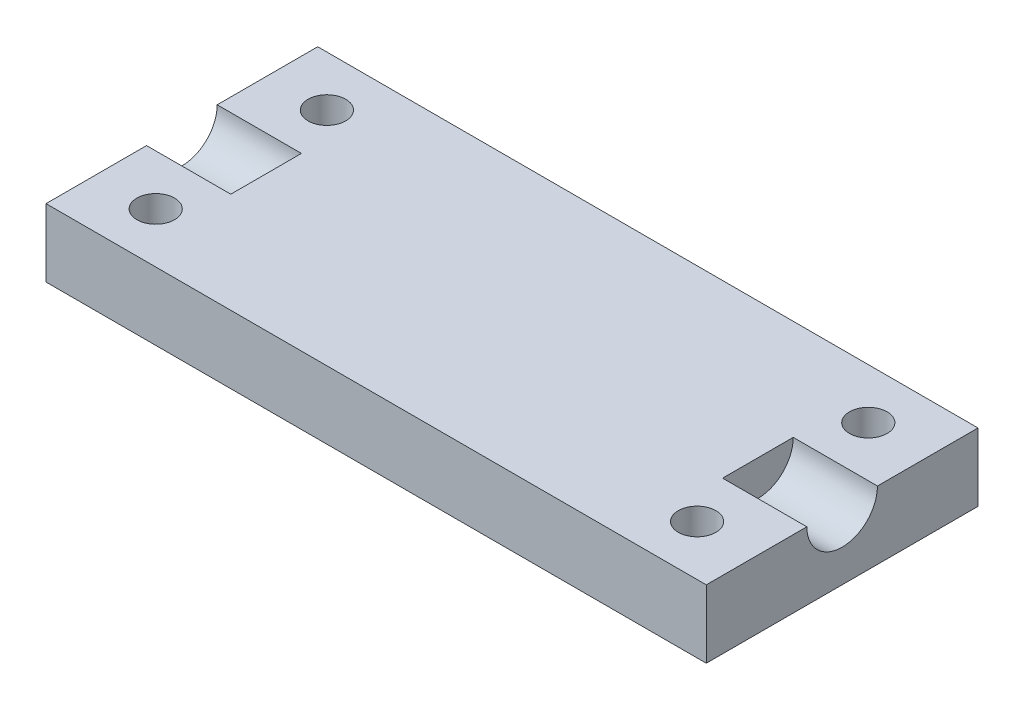
ISO-10303-21;
HEADER;
FILE_DESCRIPTION(('STEP AP214'),'2;1');
FILE_NAME('part.step','',(''),(''),'','','');
FILE_SCHEMA(('AUTOMOTIVE_DESIGN { 1 0 10303 214 1 1 1 1 }'));
ENDSEC;
DATA;
#1=APPLICATION_CONTEXT('core data for automotive mechanical design processes');
#2=APPLICATION_PROTOCOL_DEFINITION('international standard','automotive_design',2000,#1);
#3=PRODUCT_CONTEXT('',#1,'mechanical');
#4=PRODUCT('Part','Part','',(#3));
#5=PRODUCT_RELATED_PRODUCT_CATEGORY('part','',(#4));
#6=PRODUCT_DEFINITION_FORMATION('','',#4);
#7=PRODUCT_DEFINITION_CONTEXT('part definition',#1,'design');
#8=PRODUCT_DEFINITION('design','',#6,#7);
#9=PRODUCT_DEFINITION_SHAPE('','',#8);
#10=(LENGTH_UNIT() NAMED_UNIT(*) SI_UNIT(.MILLI.,.METRE.));
#11=(NAMED_UNIT(*) PLANE_ANGLE_UNIT() SI_UNIT($,.RADIAN.));
#12=(NAMED_UNIT(*) SI_UNIT($,.STERADIAN.) SOLID_ANGLE_UNIT());
#13=UNCERTAINTY_MEASURE_WITH_UNIT(LENGTH_MEASURE(1.E-05),#10,'distance_accuracy_value','');
#14=(GEOMETRIC_REPRESENTATION_CONTEXT(3) GLOBAL_UNCERTAINTY_ASSIGNED_CONTEXT((#13)) GLOBAL_UNIT_ASSIGNED_CONTEXT((#10,
#11,#12)) REPRESENTATION_CONTEXT('',''));
#15=CARTESIAN_POINT('',(0.,0.,0.));
#16=DIRECTION('',(0.,0.,1.));
#17=DIRECTION('',(1.,0.,0.));
#18=AXIS2_PLACEMENT_3D('',#15,#16,#17);
#19=CARTESIAN_POINT('',(30.861,-6.35,12.7));
#20=DIRECTION('',(1.,0.,0.));
#21=DIRECTION('',(0.,0.,-1.));
#22=AXIS2_PLACEMENT_3D('',#19,#20,#21);
#23=PLANE('',#22);
#24=CARTESIAN_POINT('',(30.861,0.,0.));
#25=DIRECTION('',(1.,0.,0.));
#26=DIRECTION('',(0.,0.,-1.));
#27=AXIS2_PLACEMENT_3D('',#24,#25,#26);
#28=CIRCLE('',#27,3.302);
#29=CARTESIAN_POINT('',(30.861,0.,3.302));
#30=VERTEX_POINT('',#29);
#31=CARTESIAN_POINT('',(30.861,0.,-3.302));
#32=VERTEX_POINT('',#31);
#33=EDGE_CURVE('E167',#30,#32,#28,.T.);
#34=ORIENTED_EDGE('',*,*,#33,.F.);
#35=DIRECTION('',(0.,0.,-1.));
#36=VECTOR('',#35,1.);
#37=CARTESIAN_POINT('',(30.861,0.,12.7));
#38=LINE('',#37,#36);
#39=CARTESIAN_POINT('',(30.861,0.,12.7));
#40=VERTEX_POINT('',#39);
#41=EDGE_CURVE('E121',#40,#30,#38,.T.);
#42=ORIENTED_EDGE('',*,*,#41,.F.);
#43=DIRECTION('',(0.,1.,0.));
#44=VECTOR('',#43,1.);
#45=CARTESIAN_POINT('',(30.861,-6.35,12.7));
#46=LINE('',#45,#44);
#47=CARTESIAN_POINT('',(30.861,-6.35,12.7));
#48=VERTEX_POINT('',#47);
#49=EDGE_CURVE('E127',#48,#40,#46,.T.);
#50=ORIENTED_EDGE('',*,*,#49,.F.);
#51=DIRECTION('',(0.,0.,-1.));
#52=VECTOR('',#51,1.);
#53=CARTESIAN_POINT('',(30.861,-6.35,12.7));
#54=LINE('',#53,#52);
#55=CARTESIAN_POINT('',(30.861,-6.35,-12.7));
#56=VERTEX_POINT('',#55);
#57=EDGE_CURVE('E126',#48,#56,#54,.T.);
#58=ORIENTED_EDGE('',*,*,#57,.T.);
#59=DIRECTION('',(0.,1.,0.));
#60=VECTOR('',#59,1.);
#61=CARTESIAN_POINT('',(30.861,-6.35,-12.7));
#62=LINE('',#61,#60);
#63=CARTESIAN_POINT('',(30.861,0.,-12.7));
#64=VERTEX_POINT('',#63);
#65=EDGE_CURVE('E133',#56,#64,#62,.T.);
#66=ORIENTED_EDGE('',*,*,#65,.T.);
#67=EDGE_CURVE('E164',#32,#64,#38,.T.);
#68=ORIENTED_EDGE('',*,*,#67,.F.);
#69=EDGE_LOOP('',(#34,#42,#50,#58,#66,#68));
#70=FACE_BOUND('',#69,.T.);
#71=ADVANCED_FACE('F33',(#70),#23,.T.);
#72=CARTESIAN_POINT('',(-30.861,-6.35,12.7));
#73=DIRECTION('',(0.,0.,1.));
#74=DIRECTION('',(1.,0.,0.));
#75=AXIS2_PLACEMENT_3D('',#72,#73,#74);
#76=PLANE('',#75);
#77=DIRECTION('',(1.,0.,0.));
#78=VECTOR('',#77,1.);
#79=CARTESIAN_POINT('',(-30.861,0.,12.7));
#80=LINE('',#79,#78);
#81=CARTESIAN_POINT('',(-30.861,0.,12.7));
#82=VERTEX_POINT('',#81);
#83=EDGE_CURVE('E119',#82,#40,#80,.T.);
#84=ORIENTED_EDGE('',*,*,#83,.F.);
#85=DIRECTION('',(0.,1.,0.));
#86=VECTOR('',#85,1.);
#87=CARTESIAN_POINT('',(-30.861,-6.35,12.7));
#88=LINE('',#87,#86);
#89=CARTESIAN_POINT('',(-30.861,-6.35,12.7));
#90=VERTEX_POINT('',#89);
#91=EDGE_CURVE('E114',#90,#82,#88,.T.);
#92=ORIENTED_EDGE('',*,*,#91,.F.);
#93=DIRECTION('',(1.,0.,0.));
#94=VECTOR('',#93,1.);
#95=CARTESIAN_POINT('',(-30.861,-6.35,12.7));
#96=LINE('',#95,#94);
#97=EDGE_CURVE('E136',#90,#48,#96,.T.);
#98=ORIENTED_EDGE('',*,*,#97,.T.);
#99=ORIENTED_EDGE('',*,*,#49,.T.);
#100=EDGE_LOOP('',(#84,#92,#98,#99));
#101=FACE_BOUND('',#100,.T.);
#102=ADVANCED_FACE('F223',(#101),#76,.T.);
#103=CARTESIAN_POINT('',(-30.861,-6.35,12.7));
#104=DIRECTION('',(-1.,0.,0.));
#105=DIRECTION('',(0.,0.,1.));
#106=AXIS2_PLACEMENT_3D('',#103,#104,#105);
#107=PLANE('',#106);
#108=CARTESIAN_POINT('',(-30.861,0.,0.));
#109=DIRECTION('',(-1.,0.,0.));
#110=DIRECTION('',(0.,0.,1.));
#111=AXIS2_PLACEMENT_3D('',#108,#109,#110);
#112=CIRCLE('',#111,3.302);
#113=CARTESIAN_POINT('',(-30.861,0.,-3.302));
#114=VERTEX_POINT('',#113);
#115=CARTESIAN_POINT('',(-30.861,0.,3.302));
#116=VERTEX_POINT('',#115);
#117=EDGE_CURVE('E96',#114,#116,#112,.T.);
#118=ORIENTED_EDGE('',*,*,#117,.F.);
#119=DIRECTION('',(0.,0.,1.));
#120=VECTOR('',#119,1.);
#121=CARTESIAN_POINT('',(-30.861,0.,12.7));
#122=LINE('',#121,#120);
#123=CARTESIAN_POINT('',(-30.861,0.,-12.7));
#124=VERTEX_POINT('',#123);
#125=EDGE_CURVE('E116',#124,#114,#122,.T.);
#126=ORIENTED_EDGE('',*,*,#125,.F.);
#127=DIRECTION('',(0.,1.,0.));
#128=VECTOR('',#127,1.);
#129=CARTESIAN_POINT('',(-30.861,-6.35,-12.7));
#130=LINE('',#129,#128);
#131=CARTESIAN_POINT('',(-30.861,-6.35,-12.7));
#132=VERTEX_POINT('',#131);
#133=EDGE_CURVE('E131',#132,#124,#130,.T.);
#134=ORIENTED_EDGE('',*,*,#133,.F.);
#135=DIRECTION('',(0.,0.,1.));
#136=VECTOR('',#135,1.);
#137=CARTESIAN_POINT('',(-30.861,-6.35,12.7));
#138=LINE('',#137,#136);
#139=EDGE_CURVE('E146',#132,#90,#138,.T.);
#140=ORIENTED_EDGE('',*,*,#139,.T.);
#141=ORIENTED_EDGE('',*,*,#91,.T.);
#142=EDGE_CURVE('E109',#116,#82,#122,.T.);
#143=ORIENTED_EDGE('',*,*,#142,.F.);
#144=EDGE_LOOP('',(#118,#126,#134,#140,#141,#143));
#145=FACE_BOUND('',#144,.T.);
#146=ADVANCED_FACE('F112',(#145),#107,.T.);
#147=CARTESIAN_POINT('',(-30.861,-6.35,-12.7));
#148=DIRECTION('',(0.,0.,-1.));
#149=DIRECTION('',(-1.,0.,0.));
#150=AXIS2_PLACEMENT_3D('',#147,#148,#149);
#151=PLANE('',#150);
#152=DIRECTION('',(-1.,0.,0.));
#153=VECTOR('',#152,1.);
#154=CARTESIAN_POINT('',(-30.861,0.,-12.7));
#155=LINE('',#154,#153);
#156=EDGE_CURVE('E117',#64,#124,#155,.T.);
#157=ORIENTED_EDGE('',*,*,#156,.F.);
#158=ORIENTED_EDGE('',*,*,#65,.F.);
#159=DIRECTION('',(-1.,0.,0.));
#160=VECTOR('',#159,1.);
#161=CARTESIAN_POINT('',(-30.861,-6.35,-12.7));
#162=LINE('',#161,#160);
#163=EDGE_CURVE('E154',#56,#132,#162,.T.);
#164=ORIENTED_EDGE('',*,*,#163,.T.);
#165=ORIENTED_EDGE('',*,*,#133,.T.);
#166=EDGE_LOOP('',(#157,#158,#164,#165));
#167=FACE_BOUND('',#166,.T.);
#168=ADVANCED_FACE('F158',(#167),#151,.T.);
#169=CARTESIAN_POINT('',(0.,-6.35,0.));
#170=DIRECTION('',(0.,-1.,0.));
#171=DIRECTION('',(0.,0.,-1.));
#172=AXIS2_PLACEMENT_3D('',#169,#170,#171);
#173=PLANE('',#172);
#174=CARTESIAN_POINT('',(-25.30475,-6.35,8.00100000000001));
#175=DIRECTION('',(0.,-1.,0.));
#176=DIRECTION('',(0.,0.,-1.));
#177=AXIS2_PLACEMENT_3D('',#174,#175,#176);
#178=CIRCLE('',#177,1.75895);
#179=CARTESIAN_POINT('',(-25.30475,-6.35,6.24205000000001));
#180=VERTEX_POINT('',#179);
#181=EDGE_CURVE('E189',#180,#180,#178,.F.);
#182=ORIENTED_EDGE('',*,*,#181,.T.);
#183=EDGE_LOOP('',(#182));
#184=FACE_BOUND('',#183,.T.);
#185=CARTESIAN_POINT('',(-25.30475,-6.35,-8.00099999999999));
#186=DIRECTION('',(0.,-1.,0.));
#187=DIRECTION('',(0.,0.,-1.));
#188=AXIS2_PLACEMENT_3D('',#185,#186,#187);
#189=CIRCLE('',#188,1.75895);
#190=CARTESIAN_POINT('',(-25.30475,-6.35,-9.75994999999999));
#191=VERTEX_POINT('',#190);
#192=EDGE_CURVE('E183',#191,#191,#189,.F.);
#193=ORIENTED_EDGE('',*,*,#192,.T.);
#194=EDGE_LOOP('',(#193));
#195=FACE_BOUND('',#194,.T.);
#196=CARTESIAN_POINT('',(25.30475,-6.35,-8.00099999999999));
#197=DIRECTION('',(0.,-1.,0.));
#198=DIRECTION('',(0.,0.,-1.));
#199=AXIS2_PLACEMENT_3D('',#196,#197,#198);
#200=CIRCLE('',#199,1.75895);
#201=CARTESIAN_POINT('',(25.30475,-6.35,-9.75994999999999));
#202=VERTEX_POINT('',#201);
#203=EDGE_CURVE('E177',#202,#202,#200,.F.);
#204=ORIENTED_EDGE('',*,*,#203,.T.);
#205=EDGE_LOOP('',(#204));
#206=FACE_BOUND('',#205,.T.);
#207=CARTESIAN_POINT('',(25.30475,-6.35,8.00100000000001));
#208=DIRECTION('',(0.,-1.,0.));
#209=DIRECTION('',(0.,0.,-1.));
#210=AXIS2_PLACEMENT_3D('',#207,#208,#209);
#211=CIRCLE('',#210,1.75895);
#212=CARTESIAN_POINT('',(25.30475,-6.35,6.24205000000001));
#213=VERTEX_POINT('',#212);
#214=EDGE_CURVE('E171',#213,#213,#211,.F.);
#215=ORIENTED_EDGE('',*,*,#214,.T.);
#216=EDGE_LOOP('',(#215));
#217=FACE_BOUND('',#216,.T.);
#218=ORIENTED_EDGE('',*,*,#57,.F.);
#219=ORIENTED_EDGE('',*,*,#97,.F.);
#220=ORIENTED_EDGE('',*,*,#139,.F.);
#221=ORIENTED_EDGE('',*,*,#163,.F.);
#222=EDGE_LOOP('',(#218,#219,#220,#221));
#223=FACE_BOUND('',#222,.T.);
#224=ADVANCED_FACE('F153',(#184,#195,#206,#217,#223),#173,.T.);
#225=CARTESIAN_POINT('',(0.,0.,0.));
#226=DIRECTION('',(0.,-1.,0.));
#227=DIRECTION('',(0.,0.,-1.));
#228=AXIS2_PLACEMENT_3D('',#225,#226,#227);
#229=PLANE('',#228);
#230=CARTESIAN_POINT('',(-25.30475,0.,8.00100000000001));
#231=DIRECTION('',(0.,1.,0.));
#232=DIRECTION('',(0.,0.,1.));
#233=AXIS2_PLACEMENT_3D('',#230,#231,#232);
#234=CIRCLE('',#233,1.75895);
#235=CARTESIAN_POINT('',(-25.30475,0.,9.75995000000001));
#236=VERTEX_POINT('',#235);
#237=EDGE_CURVE('E186',#236,#236,#234,.T.);
#238=ORIENTED_EDGE('',*,*,#237,.F.);
#239=EDGE_LOOP('',(#238));
#240=FACE_BOUND('',#239,.T.);
#241=CARTESIAN_POINT('',(-25.30475,0.,-8.00099999999999));
#242=DIRECTION('',(0.,1.,0.));
#243=DIRECTION('',(0.,0.,1.));
#244=AXIS2_PLACEMENT_3D('',#241,#242,#243);
#245=CIRCLE('',#244,1.75895);
#246=CARTESIAN_POINT('',(-25.30475,0.,-6.24204999999999));
#247=VERTEX_POINT('',#246);
#248=EDGE_CURVE('E180',#247,#247,#245,.T.);
#249=ORIENTED_EDGE('',*,*,#248,.F.);
#250=EDGE_LOOP('',(#249));
#251=FACE_BOUND('',#250,.T.);
#252=CARTESIAN_POINT('',(25.30475,0.,-8.00099999999999));
#253=DIRECTION('',(0.,1.,0.));
#254=DIRECTION('',(0.,0.,1.));
#255=AXIS2_PLACEMENT_3D('',#252,#253,#254);
#256=CIRCLE('',#255,1.75895);
#257=CARTESIAN_POINT('',(25.30475,0.,-6.24204999999999));
#258=VERTEX_POINT('',#257);
#259=EDGE_CURVE('E174',#258,#258,#256,.T.);
#260=ORIENTED_EDGE('',*,*,#259,.F.);
#261=EDGE_LOOP('',(#260));
#262=FACE_BOUND('',#261,.T.);
#263=CARTESIAN_POINT('',(25.30475,0.,8.00100000000001));
#264=DIRECTION('',(0.,1.,0.));
#265=DIRECTION('',(0.,0.,1.));
#266=AXIS2_PLACEMENT_3D('',#263,#264,#265);
#267=CIRCLE('',#266,1.75895);
#268=CARTESIAN_POINT('',(25.30475,0.,9.75995000000001));
#269=VERTEX_POINT('',#268);
#270=EDGE_CURVE('E104',#269,#269,#267,.T.);
#271=ORIENTED_EDGE('',*,*,#270,.F.);
#272=EDGE_LOOP('',(#271));
#273=FACE_BOUND('',#272,.T.);
#274=DIRECTION('',(0.,0.,-1.));
#275=VECTOR('',#274,1.);
#276=CARTESIAN_POINT('',(-22.987,0.,0.));
#277=LINE('',#276,#275);
#278=CARTESIAN_POINT('',(-22.987,0.,3.302));
#279=VERTEX_POINT('',#278);
#280=CARTESIAN_POINT('',(-22.987,0.,-3.302));
#281=VERTEX_POINT('',#280);
#282=EDGE_CURVE('E111',#279,#281,#277,.T.);
#283=ORIENTED_EDGE('',*,*,#282,.F.);
#284=DIRECTION('',(-1.,0.,0.));
#285=VECTOR('',#284,1.);
#286=CARTESIAN_POINT('',(-22.987,0.,3.302));
#287=LINE('',#286,#285);
#288=EDGE_CURVE('E11',#279,#116,#287,.T.);
#289=ORIENTED_EDGE('',*,*,#288,.T.);
#290=ORIENTED_EDGE('',*,*,#142,.T.);
#291=ORIENTED_EDGE('',*,*,#83,.T.);
#292=ORIENTED_EDGE('',*,*,#41,.T.);
#293=DIRECTION('',(1.,0.,0.));
#294=VECTOR('',#293,1.);
#295=CARTESIAN_POINT('',(22.987,0.,3.302));
#296=LINE('',#295,#294);
#297=CARTESIAN_POINT('',(22.987,0.,3.302));
#298=VERTEX_POINT('',#297);
#299=EDGE_CURVE('E138',#30,#298,#296,.F.);
#300=ORIENTED_EDGE('',*,*,#299,.T.);
#301=DIRECTION('',(0.,0.,1.));
#302=VECTOR('',#301,1.);
#303=CARTESIAN_POINT('',(22.987,0.,0.));
#304=LINE('',#303,#302);
#305=CARTESIAN_POINT('',(22.987,0.,-3.302));
#306=VERTEX_POINT('',#305);
#307=EDGE_CURVE('E129',#306,#298,#304,.T.);
#308=ORIENTED_EDGE('',*,*,#307,.F.);
#309=DIRECTION('',(1.,0.,0.));
#310=VECTOR('',#309,1.);
#311=CARTESIAN_POINT('',(22.987,0.,-3.302));
#312=LINE('',#311,#310);
#313=EDGE_CURVE('E141',#306,#32,#312,.T.);
#314=ORIENTED_EDGE('',*,*,#313,.T.);
#315=ORIENTED_EDGE('',*,*,#67,.T.);
#316=ORIENTED_EDGE('',*,*,#156,.T.);
#317=ORIENTED_EDGE('',*,*,#125,.T.);
#318=DIRECTION('',(-1.,0.,0.));
#319=VECTOR('',#318,1.);
#320=CARTESIAN_POINT('',(-22.987,0.,-3.302));
#321=LINE('',#320,#319);
#322=EDGE_CURVE('E40',#114,#281,#321,.F.);
#323=ORIENTED_EDGE('',*,*,#322,.T.);
#324=EDGE_LOOP('',(#283,#289,#290,#291,#292,#300,#308,#314,#315,#316,#317,#323));
#325=FACE_BOUND('',#324,.T.);
#326=ADVANCED_FACE('F107',(#240,#251,#262,#273,#325),#229,.F.);
#327=CARTESIAN_POINT('',(22.987,0.,0.));
#328=DIRECTION('',(1.,0.,0.));
#329=DIRECTION('',(0.,0.,-1.));
#330=AXIS2_PLACEMENT_3D('',#327,#328,#329);
#331=CYLINDRICAL_SURFACE('',#330,3.302);
#332=CARTESIAN_POINT('',(22.987,0.,0.));
#333=DIRECTION('',(1.,0.,0.));
#334=DIRECTION('',(0.,0.,-1.));
#335=AXIS2_PLACEMENT_3D('',#332,#333,#334);
#336=CIRCLE('',#335,3.302);
#337=EDGE_CURVE('E53',#298,#306,#336,.T.);
#338=ORIENTED_EDGE('',*,*,#337,.F.);
#339=ORIENTED_EDGE('',*,*,#299,.F.);
#340=ORIENTED_EDGE('',*,*,#33,.T.);
#341=ORIENTED_EDGE('',*,*,#313,.F.);
#342=EDGE_LOOP('',(#338,#339,#340,#341));
#343=FACE_BOUND('',#342,.T.);
#344=ADVANCED_FACE('F199',(#343),#331,.F.);
#345=CARTESIAN_POINT('',(22.987,0.,0.));
#346=DIRECTION('',(1.,0.,0.));
#347=DIRECTION('',(0.,0.,-1.));
#348=AXIS2_PLACEMENT_3D('',#345,#346,#347);
#349=PLANE('',#348);
#350=ORIENTED_EDGE('',*,*,#307,.T.);
#351=ORIENTED_EDGE('',*,*,#337,.T.);
#352=EDGE_LOOP('',(#350,#351));
#353=FACE_BOUND('',#352,.T.);
#354=ADVANCED_FACE('F233',(#353),#349,.T.);
#355=CARTESIAN_POINT('',(-22.987,0.,0.));
#356=DIRECTION('',(-1.,0.,0.));
#357=DIRECTION('',(0.,0.,1.));
#358=AXIS2_PLACEMENT_3D('',#355,#356,#357);
#359=CYLINDRICAL_SURFACE('',#358,3.302);
#360=CARTESIAN_POINT('',(-22.987,0.,0.));
#361=DIRECTION('',(-1.,0.,0.));
#362=DIRECTION('',(0.,0.,1.));
#363=AXIS2_PLACEMENT_3D('',#360,#361,#362);
#364=CIRCLE('',#363,3.302);
#365=EDGE_CURVE('E46',#281,#279,#364,.T.);
#366=ORIENTED_EDGE('',*,*,#365,.F.);
#367=ORIENTED_EDGE('',*,*,#322,.F.);
#368=ORIENTED_EDGE('',*,*,#117,.T.);
#369=ORIENTED_EDGE('',*,*,#288,.F.);
#370=EDGE_LOOP('',(#366,#367,#368,#369));
#371=FACE_BOUND('',#370,.T.);
#372=ADVANCED_FACE('F97',(#371),#359,.F.);
#373=CARTESIAN_POINT('',(-22.987,0.,0.));
#374=DIRECTION('',(-1.,0.,0.));
#375=DIRECTION('',(0.,0.,1.));
#376=AXIS2_PLACEMENT_3D('',#373,#374,#375);
#377=PLANE('',#376);
#378=ORIENTED_EDGE('',*,*,#282,.T.);
#379=ORIENTED_EDGE('',*,*,#365,.T.);
#380=EDGE_LOOP('',(#378,#379));
#381=FACE_BOUND('',#380,.T.);
#382=ADVANCED_FACE('F210',(#381),#377,.T.);
#383=CARTESIAN_POINT('',(25.30475,-6.351,8.00100000000001));
#384=DIRECTION('',(0.,1.,0.));
#385=DIRECTION('',(0.,0.,1.));
#386=AXIS2_PLACEMENT_3D('',#383,#384,#385);
#387=CYLINDRICAL_SURFACE('',#386,1.75895);
#388=ORIENTED_EDGE('',*,*,#214,.F.);
#389=EDGE_LOOP('',(#388));
#390=FACE_BOUND('',#389,.T.);
#391=ORIENTED_EDGE('',*,*,#270,.T.);
#392=EDGE_LOOP('',(#391));
#393=FACE_BOUND('',#392,.T.);
#394=ADVANCED_FACE('F207',(#390,#393),#387,.F.);
#395=CARTESIAN_POINT('',(25.30475,-6.351,-8.00099999999999));
#396=DIRECTION('',(0.,1.,0.));
#397=DIRECTION('',(0.,0.,1.));
#398=AXIS2_PLACEMENT_3D('',#395,#396,#397);
#399=CYLINDRICAL_SURFACE('',#398,1.75895);
#400=ORIENTED_EDGE('',*,*,#203,.F.);
#401=EDGE_LOOP('',(#400));
#402=FACE_BOUND('',#401,.T.);
#403=ORIENTED_EDGE('',*,*,#259,.T.);
#404=EDGE_LOOP('',(#403));
#405=FACE_BOUND('',#404,.T.);
#406=ADVANCED_FACE('F209',(#402,#405),#399,.F.);
#407=CARTESIAN_POINT('',(-25.30475,-6.351,-8.00099999999999));
#408=DIRECTION('',(0.,1.,0.));
#409=DIRECTION('',(0.,0.,1.));
#410=AXIS2_PLACEMENT_3D('',#407,#408,#409);
#411=CYLINDRICAL_SURFACE('',#410,1.75895);
#412=ORIENTED_EDGE('',*,*,#192,.F.);
#413=EDGE_LOOP('',(#412));
#414=FACE_BOUND('',#413,.T.);
#415=ORIENTED_EDGE('',*,*,#248,.T.);
#416=EDGE_LOOP('',(#415));
#417=FACE_BOUND('',#416,.T.);
#418=ADVANCED_FACE('F217',(#414,#417),#411,.F.);
#419=CARTESIAN_POINT('',(-25.30475,-6.351,8.00100000000001));
#420=DIRECTION('',(0.,1.,0.));
#421=DIRECTION('',(0.,0.,1.));
#422=AXIS2_PLACEMENT_3D('',#419,#420,#421);
#423=CYLINDRICAL_SURFACE('',#422,1.75895);
#424=ORIENTED_EDGE('',*,*,#181,.F.);
#425=EDGE_LOOP('',(#424));
#426=FACE_BOUND('',#425,.T.);
#427=ORIENTED_EDGE('',*,*,#237,.T.);
#428=EDGE_LOOP('',(#427));
#429=FACE_BOUND('',#428,.T.);
#430=ADVANCED_FACE('F195',(#426,#429),#423,.F.);
#431=CLOSED_SHELL('',(#71,#102,#146,#168,#224,#326,#344,#354,#372,#382,#394,#406,#418,#430));
#432=MANIFOLD_SOLID_BREP('B2',#431);
#433=ADVANCED_BREP_SHAPE_REPRESENTATION('',(#18,#432),#14);
#434=SHAPE_DEFINITION_REPRESENTATION(#9,#433);
ENDSEC;
END-ISO-10303-21;
